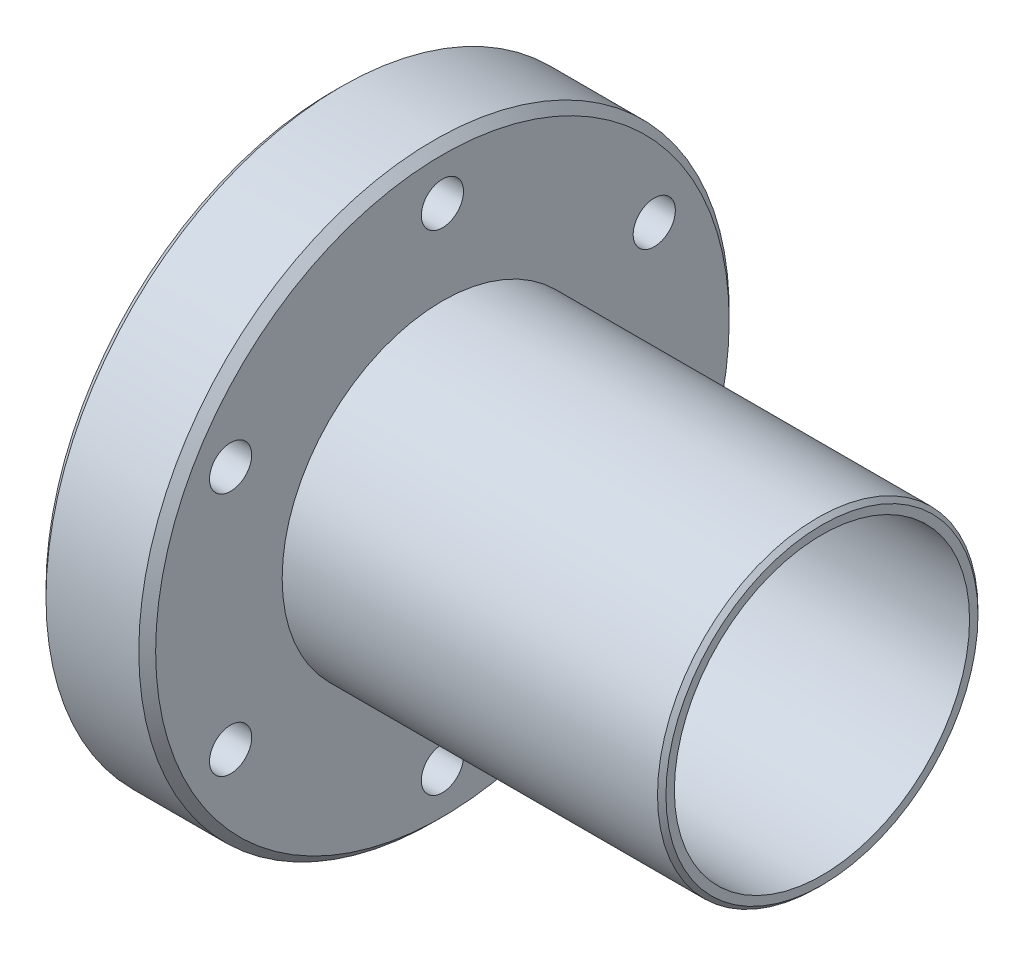
ISO-10303-21;
HEADER;
FILE_DESCRIPTION(('STEP AP214'),'2;1');
FILE_NAME('part.step','',(''),(''),'','','');
FILE_SCHEMA(('AUTOMOTIVE_DESIGN { 1 0 10303 214 1 1 1 1 }'));
ENDSEC;
DATA;
#1=APPLICATION_CONTEXT('core data for automotive mechanical design processes');
#2=APPLICATION_PROTOCOL_DEFINITION('international standard','automotive_design',2000,#1);
#3=PRODUCT_CONTEXT('',#1,'mechanical');
#4=PRODUCT('Part','Part','',(#3));
#5=PRODUCT_RELATED_PRODUCT_CATEGORY('part','',(#4));
#6=PRODUCT_DEFINITION_FORMATION('','',#4);
#7=PRODUCT_DEFINITION_CONTEXT('part definition',#1,'design');
#8=PRODUCT_DEFINITION('design','',#6,#7);
#9=PRODUCT_DEFINITION_SHAPE('','',#8);
#10=(LENGTH_UNIT() NAMED_UNIT(*) SI_UNIT(.MILLI.,.METRE.));
#11=(NAMED_UNIT(*) PLANE_ANGLE_UNIT() SI_UNIT($,.RADIAN.));
#12=(NAMED_UNIT(*) SI_UNIT($,.STERADIAN.) SOLID_ANGLE_UNIT());
#13=UNCERTAINTY_MEASURE_WITH_UNIT(LENGTH_MEASURE(1.E-05),#10,'distance_accuracy_value','');
#14=(GEOMETRIC_REPRESENTATION_CONTEXT(3) GLOBAL_UNCERTAINTY_ASSIGNED_CONTEXT((#13)) GLOBAL_UNIT_ASSIGNED_CONTEXT((#10,
#11,#12)) REPRESENTATION_CONTEXT('',''));
#15=CARTESIAN_POINT('',(0.,0.,0.));
#16=DIRECTION('',(0.,0.,1.));
#17=DIRECTION('',(1.,0.,0.));
#18=AXIS2_PLACEMENT_3D('',#15,#16,#17);
#19=CARTESIAN_POINT('',(0.,0.,0.));
#20=DIRECTION('',(-1.,0.,0.));
#21=DIRECTION('',(0.,0.,1.));
#22=AXIS2_PLACEMENT_3D('',#19,#20,#21);
#23=CYLINDRICAL_SURFACE('',#22,17.5);
#24=CARTESIAN_POINT('',(58.,0.,0.));
#25=DIRECTION('',(-1.,0.,0.));
#26=DIRECTION('',(0.,0.,1.));
#27=AXIS2_PLACEMENT_3D('',#24,#25,#26);
#28=CIRCLE('',#27,17.5);
#29=CARTESIAN_POINT('',(58.,0.,17.5));
#30=VERTEX_POINT('',#29);
#31=EDGE_CURVE('E119',#30,#30,#28,.T.);
#32=ORIENTED_EDGE('',*,*,#31,.F.);
#33=EDGE_LOOP('',(#32));
#34=FACE_BOUND('',#33,.T.);
#35=CARTESIAN_POINT('',(0.,0.,0.));
#36=DIRECTION('',(-1.,0.,0.));
#37=DIRECTION('',(0.,0.,1.));
#38=AXIS2_PLACEMENT_3D('',#35,#36,#37);
#39=CIRCLE('',#38,17.5);
#40=CARTESIAN_POINT('',(0.,0.,17.5));
#41=VERTEX_POINT('',#40);
#42=EDGE_CURVE('E88',#41,#41,#39,.T.);
#43=ORIENTED_EDGE('',*,*,#42,.T.);
#44=EDGE_LOOP('',(#43));
#45=FACE_BOUND('',#44,.T.);
#46=ADVANCED_FACE('F55',(#34,#45),#23,.F.);
#47=CARTESIAN_POINT('',(0.,17.5,0.));
#48=DIRECTION('',(1.,0.,0.));
#49=DIRECTION('',(0.,0.,-1.));
#50=AXIS2_PLACEMENT_3D('',#47,#48,#49);
#51=PLANE('',#50);
#52=CARTESIAN_POINT('',(0.,0.,0.));
#53=DIRECTION('',(1.,0.,0.));
#54=DIRECTION('',(0.,0.,-1.));
#55=AXIS2_PLACEMENT_3D('',#52,#53,#54);
#56=CIRCLE('',#55,34.);
#57=CARTESIAN_POINT('',(0.,0.,-34.));
#58=VERTEX_POINT('',#57);
#59=EDGE_CURVE('E84',#58,#58,#56,.F.);
#60=ORIENTED_EDGE('',*,*,#59,.T.);
#61=EDGE_LOOP('',(#60));
#62=FACE_BOUND('',#61,.T.);
#63=CARTESIAN_POINT('',(0.,14.5000000000003,-25.1147367097486));
#64=DIRECTION('',(-1.,0.,0.));
#65=DIRECTION('',(0.,0.,1.));
#66=AXIS2_PLACEMENT_3D('',#63,#64,#65);
#67=CIRCLE('',#66,2.49999999999999);
#68=CARTESIAN_POINT('',(0.,14.5000000000003,-22.6147367097486));
#69=VERTEX_POINT('',#68);
#70=EDGE_CURVE('E94',#69,#69,#67,.T.);
#71=ORIENTED_EDGE('',*,*,#70,.F.);
#72=EDGE_LOOP('',(#71));
#73=FACE_BOUND('',#72,.T.);
#74=CARTESIAN_POINT('',(0.,-14.4999999999998,-25.1147367097489));
#75=DIRECTION('',(-1.,0.,0.));
#76=DIRECTION('',(0.,0.,1.));
#77=AXIS2_PLACEMENT_3D('',#74,#75,#76);
#78=CIRCLE('',#77,2.49999999999999);
#79=CARTESIAN_POINT('',(0.,-14.4999999999998,-22.6147367097489));
#80=VERTEX_POINT('',#79);
#81=EDGE_CURVE('E93',#80,#80,#78,.T.);
#82=ORIENTED_EDGE('',*,*,#81,.F.);
#83=EDGE_LOOP('',(#82));
#84=FACE_BOUND('',#83,.T.);
#85=CARTESIAN_POINT('',(0.,-29.,0.));
#86=DIRECTION('',(-1.,0.,0.));
#87=DIRECTION('',(0.,0.,1.));
#88=AXIS2_PLACEMENT_3D('',#85,#86,#87);
#89=CIRCLE('',#88,2.49999999999999);
#90=CARTESIAN_POINT('',(0.,-29.,2.49999999999999));
#91=VERTEX_POINT('',#90);
#92=EDGE_CURVE('E99',#91,#91,#89,.T.);
#93=ORIENTED_EDGE('',*,*,#92,.F.);
#94=EDGE_LOOP('',(#93));
#95=FACE_BOUND('',#94,.T.);
#96=CARTESIAN_POINT('',(0.,-14.5000000000001,25.1147367097487));
#97=DIRECTION('',(-1.,0.,0.));
#98=DIRECTION('',(0.,0.,1.));
#99=AXIS2_PLACEMENT_3D('',#96,#97,#98);
#100=CIRCLE('',#99,2.49999999999999);
#101=CARTESIAN_POINT('',(0.,-14.5000000000001,27.6147367097486));
#102=VERTEX_POINT('',#101);
#103=EDGE_CURVE('E104',#102,#102,#100,.T.);
#104=ORIENTED_EDGE('',*,*,#103,.F.);
#105=EDGE_LOOP('',(#104));
#106=FACE_BOUND('',#105,.T.);
#107=CARTESIAN_POINT('',(0.,14.4999999999999,25.1147367097488));
#108=DIRECTION('',(-1.,0.,0.));
#109=DIRECTION('',(0.,0.,1.));
#110=AXIS2_PLACEMENT_3D('',#107,#108,#109);
#111=CIRCLE('',#110,2.49999999999999);
#112=CARTESIAN_POINT('',(0.,14.4999999999999,27.6147367097487));
#113=VERTEX_POINT('',#112);
#114=EDGE_CURVE('E109',#113,#113,#111,.T.);
#115=ORIENTED_EDGE('',*,*,#114,.F.);
#116=EDGE_LOOP('',(#115));
#117=FACE_BOUND('',#116,.T.);
#118=CARTESIAN_POINT('',(0.,29.,0.));
#119=DIRECTION('',(-1.,0.,0.));
#120=DIRECTION('',(0.,0.,1.));
#121=AXIS2_PLACEMENT_3D('',#118,#119,#120);
#122=CIRCLE('',#121,2.49999999999998);
#123=CARTESIAN_POINT('',(0.,29.,2.49999999999998));
#124=VERTEX_POINT('',#123);
#125=EDGE_CURVE('E114',#124,#124,#122,.T.);
#126=ORIENTED_EDGE('',*,*,#125,.F.);
#127=EDGE_LOOP('',(#126));
#128=FACE_BOUND('',#127,.T.);
#129=ORIENTED_EDGE('',*,*,#42,.F.);
#130=EDGE_LOOP('',(#129));
#131=FACE_BOUND('',#130,.T.);
#132=ADVANCED_FACE('F152',(#62,#73,#84,#95,#106,#117,#128,#131),#51,.F.);
#133=CARTESIAN_POINT('',(0.,0.,0.));
#134=DIRECTION('',(-1.,0.,0.));
#135=DIRECTION('',(0.,0.,1.));
#136=AXIS2_PLACEMENT_3D('',#133,#134,#135);
#137=CYLINDRICAL_SURFACE('',#136,35.);
#138=CARTESIAN_POINT('',(12.,0.,0.));
#139=DIRECTION('',(-1.,0.,0.));
#140=DIRECTION('',(0.,0.,1.));
#141=AXIS2_PLACEMENT_3D('',#138,#139,#140);
#142=CIRCLE('',#141,35.);
#143=CARTESIAN_POINT('',(12.,0.,35.));
#144=VERTEX_POINT('',#143);
#145=EDGE_CURVE('E74',#144,#144,#142,.T.);
#146=ORIENTED_EDGE('',*,*,#145,.T.);
#147=EDGE_LOOP('',(#146));
#148=FACE_BOUND('',#147,.T.);
#149=CARTESIAN_POINT('',(1.00000000000003,0.,0.));
#150=DIRECTION('',(1.,0.,0.));
#151=DIRECTION('',(0.,0.,-1.));
#152=AXIS2_PLACEMENT_3D('',#149,#150,#151);
#153=CIRCLE('',#152,35.);
#154=CARTESIAN_POINT('',(1.00000000000003,0.,-35.));
#155=VERTEX_POINT('',#154);
#156=EDGE_CURVE('E80',#155,#155,#153,.T.);
#157=ORIENTED_EDGE('',*,*,#156,.T.);
#158=EDGE_LOOP('',(#157));
#159=FACE_BOUND('',#158,.T.);
#160=ADVANCED_FACE('F155',(#148,#159),#137,.T.);
#161=CARTESIAN_POINT('',(13.,35.,0.));
#162=DIRECTION('',(-1.,0.,0.));
#163=DIRECTION('',(0.,0.,1.));
#164=AXIS2_PLACEMENT_3D('',#161,#162,#163);
#165=PLANE('',#164);
#166=CARTESIAN_POINT('',(13.,0.,0.));
#167=DIRECTION('',(-1.,0.,0.));
#168=DIRECTION('',(0.,0.,1.));
#169=AXIS2_PLACEMENT_3D('',#166,#167,#168);
#170=CIRCLE('',#169,34.);
#171=CARTESIAN_POINT('',(13.,0.,34.));
#172=VERTEX_POINT('',#171);
#173=EDGE_CURVE('E69',#172,#172,#170,.F.);
#174=ORIENTED_EDGE('',*,*,#173,.T.);
#175=EDGE_LOOP('',(#174));
#176=FACE_BOUND('',#175,.T.);
#177=CARTESIAN_POINT('',(13.,14.5000000000003,-25.1147367097486));
#178=DIRECTION('',(-1.,0.,0.));
#179=DIRECTION('',(0.,0.,1.));
#180=AXIS2_PLACEMENT_3D('',#177,#178,#179);
#181=CIRCLE('',#180,2.49999999999999);
#182=CARTESIAN_POINT('',(13.,14.5000000000003,-22.6147367097486));
#183=VERTEX_POINT('',#182);
#184=EDGE_CURVE('E89',#183,#183,#181,.T.);
#185=ORIENTED_EDGE('',*,*,#184,.T.);
#186=EDGE_LOOP('',(#185));
#187=FACE_BOUND('',#186,.T.);
#188=CARTESIAN_POINT('',(13.,-14.4999999999998,-25.1147367097489));
#189=DIRECTION('',(-1.,0.,0.));
#190=DIRECTION('',(0.,0.,1.));
#191=AXIS2_PLACEMENT_3D('',#188,#189,#190);
#192=CIRCLE('',#191,2.49999999999999);
#193=CARTESIAN_POINT('',(13.,-14.4999999999998,-22.6147367097489));
#194=VERTEX_POINT('',#193);
#195=EDGE_CURVE('E95',#194,#194,#192,.T.);
#196=ORIENTED_EDGE('',*,*,#195,.T.);
#197=EDGE_LOOP('',(#196));
#198=FACE_BOUND('',#197,.T.);
#199=CARTESIAN_POINT('',(13.,-29.,0.));
#200=DIRECTION('',(-1.,0.,0.));
#201=DIRECTION('',(0.,0.,1.));
#202=AXIS2_PLACEMENT_3D('',#199,#200,#201);
#203=CIRCLE('',#202,2.49999999999999);
#204=CARTESIAN_POINT('',(13.,-29.,2.49999999999999));
#205=VERTEX_POINT('',#204);
#206=EDGE_CURVE('E100',#205,#205,#203,.T.);
#207=ORIENTED_EDGE('',*,*,#206,.T.);
#208=EDGE_LOOP('',(#207));
#209=FACE_BOUND('',#208,.T.);
#210=CARTESIAN_POINT('',(13.,-14.5000000000001,25.1147367097487));
#211=DIRECTION('',(-1.,0.,0.));
#212=DIRECTION('',(0.,0.,1.));
#213=AXIS2_PLACEMENT_3D('',#210,#211,#212);
#214=CIRCLE('',#213,2.49999999999999);
#215=CARTESIAN_POINT('',(13.,-14.5000000000001,27.6147367097486));
#216=VERTEX_POINT('',#215);
#217=EDGE_CURVE('E105',#216,#216,#214,.T.);
#218=ORIENTED_EDGE('',*,*,#217,.T.);
#219=EDGE_LOOP('',(#218));
#220=FACE_BOUND('',#219,.T.);
#221=CARTESIAN_POINT('',(13.,14.4999999999999,25.1147367097488));
#222=DIRECTION('',(-1.,0.,0.));
#223=DIRECTION('',(0.,0.,1.));
#224=AXIS2_PLACEMENT_3D('',#221,#222,#223);
#225=CIRCLE('',#224,2.49999999999999);
#226=CARTESIAN_POINT('',(13.,14.4999999999999,27.6147367097487));
#227=VERTEX_POINT('',#226);
#228=EDGE_CURVE('E110',#227,#227,#225,.T.);
#229=ORIENTED_EDGE('',*,*,#228,.T.);
#230=EDGE_LOOP('',(#229));
#231=FACE_BOUND('',#230,.T.);
#232=CARTESIAN_POINT('',(13.,29.,0.));
#233=DIRECTION('',(-1.,0.,0.));
#234=DIRECTION('',(0.,0.,1.));
#235=AXIS2_PLACEMENT_3D('',#232,#233,#234);
#236=CIRCLE('',#235,2.49999999999999);
#237=CARTESIAN_POINT('',(13.,29.,2.49999999999999));
#238=VERTEX_POINT('',#237);
#239=EDGE_CURVE('E115',#238,#238,#236,.T.);
#240=ORIENTED_EDGE('',*,*,#239,.T.);
#241=EDGE_LOOP('',(#240));
#242=FACE_BOUND('',#241,.T.);
#243=CARTESIAN_POINT('',(13.,0.,0.));
#244=DIRECTION('',(-1.,0.,0.));
#245=DIRECTION('',(0.,0.,1.));
#246=AXIS2_PLACEMENT_3D('',#243,#244,#245);
#247=CIRCLE('',#246,19.);
#248=CARTESIAN_POINT('',(13.,0.,19.));
#249=VERTEX_POINT('',#248);
#250=EDGE_CURVE('E123',#249,#249,#247,.T.);
#251=ORIENTED_EDGE('',*,*,#250,.T.);
#252=EDGE_LOOP('',(#251));
#253=FACE_BOUND('',#252,.T.);
#254=ADVANCED_FACE('F203',(#176,#187,#198,#209,#220,#231,#242,#253),#165,.F.);
#255=CARTESIAN_POINT('',(0.,0.,0.));
#256=DIRECTION('',(-1.,0.,0.));
#257=DIRECTION('',(0.,0.,1.));
#258=AXIS2_PLACEMENT_3D('',#255,#256,#257);
#259=CYLINDRICAL_SURFACE('',#258,19.);
#260=CARTESIAN_POINT('',(57.5,0.,0.));
#261=DIRECTION('',(-1.,0.,0.));
#262=DIRECTION('',(0.,0.,1.));
#263=AXIS2_PLACEMENT_3D('',#260,#261,#262);
#264=CIRCLE('',#263,19.);
#265=CARTESIAN_POINT('',(57.5,0.,19.));
#266=VERTEX_POINT('',#265);
#267=EDGE_CURVE('E64',#266,#266,#264,.T.);
#268=ORIENTED_EDGE('',*,*,#267,.T.);
#269=EDGE_LOOP('',(#268));
#270=FACE_BOUND('',#269,.T.);
#271=ORIENTED_EDGE('',*,*,#250,.F.);
#272=EDGE_LOOP('',(#271));
#273=FACE_BOUND('',#272,.T.);
#274=ADVANCED_FACE('F209',(#270,#273),#259,.T.);
#275=CARTESIAN_POINT('',(58.,19.,0.));
#276=DIRECTION('',(-1.,0.,0.));
#277=DIRECTION('',(0.,0.,1.));
#278=AXIS2_PLACEMENT_3D('',#275,#276,#277);
#279=PLANE('',#278);
#280=CARTESIAN_POINT('',(58.,0.,0.));
#281=DIRECTION('',(-1.,0.,0.));
#282=DIRECTION('',(0.,0.,1.));
#283=AXIS2_PLACEMENT_3D('',#280,#281,#282);
#284=CIRCLE('',#283,18.5);
#285=CARTESIAN_POINT('',(58.,0.,18.5));
#286=VERTEX_POINT('',#285);
#287=EDGE_CURVE('E10',#286,#286,#284,.F.);
#288=ORIENTED_EDGE('',*,*,#287,.T.);
#289=EDGE_LOOP('',(#288));
#290=FACE_BOUND('',#289,.T.);
#291=ORIENTED_EDGE('',*,*,#31,.T.);
#292=EDGE_LOOP('',(#291));
#293=FACE_BOUND('',#292,.T.);
#294=ADVANCED_FACE('F214',(#290,#293),#279,.F.);
#295=CARTESIAN_POINT('',(0.,29.,0.));
#296=DIRECTION('',(-1.,0.,0.));
#297=DIRECTION('',(0.,0.,1.));
#298=AXIS2_PLACEMENT_3D('',#295,#296,#297);
#299=CYLINDRICAL_SURFACE('',#298,2.49999999999999);
#300=ORIENTED_EDGE('',*,*,#125,.T.);
#301=EDGE_LOOP('',(#300));
#302=FACE_BOUND('',#301,.T.);
#303=ORIENTED_EDGE('',*,*,#239,.F.);
#304=EDGE_LOOP('',(#303));
#305=FACE_BOUND('',#304,.T.);
#306=ADVANCED_FACE('F217',(#302,#305),#299,.F.);
#307=CARTESIAN_POINT('',(0.,14.4999999999999,25.1147367097488));
#308=DIRECTION('',(-1.,0.,0.));
#309=DIRECTION('',(0.,0.,1.));
#310=AXIS2_PLACEMENT_3D('',#307,#308,#309);
#311=CYLINDRICAL_SURFACE('',#310,2.49999999999999);
#312=ORIENTED_EDGE('',*,*,#114,.T.);
#313=EDGE_LOOP('',(#312));
#314=FACE_BOUND('',#313,.T.);
#315=ORIENTED_EDGE('',*,*,#228,.F.);
#316=EDGE_LOOP('',(#315));
#317=FACE_BOUND('',#316,.T.);
#318=ADVANCED_FACE('F220',(#314,#317),#311,.F.);
#319=CARTESIAN_POINT('',(0.,-14.5000000000001,25.1147367097487));
#320=DIRECTION('',(-1.,0.,0.));
#321=DIRECTION('',(0.,0.,1.));
#322=AXIS2_PLACEMENT_3D('',#319,#320,#321);
#323=CYLINDRICAL_SURFACE('',#322,2.49999999999999);
#324=ORIENTED_EDGE('',*,*,#103,.T.);
#325=EDGE_LOOP('',(#324));
#326=FACE_BOUND('',#325,.T.);
#327=ORIENTED_EDGE('',*,*,#217,.F.);
#328=EDGE_LOOP('',(#327));
#329=FACE_BOUND('',#328,.T.);
#330=ADVANCED_FACE('F224',(#326,#329),#323,.F.);
#331=CARTESIAN_POINT('',(0.,-29.,0.));
#332=DIRECTION('',(-1.,0.,0.));
#333=DIRECTION('',(0.,0.,1.));
#334=AXIS2_PLACEMENT_3D('',#331,#332,#333);
#335=CYLINDRICAL_SURFACE('',#334,2.49999999999999);
#336=ORIENTED_EDGE('',*,*,#92,.T.);
#337=EDGE_LOOP('',(#336));
#338=FACE_BOUND('',#337,.T.);
#339=ORIENTED_EDGE('',*,*,#206,.F.);
#340=EDGE_LOOP('',(#339));
#341=FACE_BOUND('',#340,.T.);
#342=ADVANCED_FACE('F228',(#338,#341),#335,.F.);
#343=CARTESIAN_POINT('',(0.,-14.4999999999998,-25.1147367097489));
#344=DIRECTION('',(-1.,0.,0.));
#345=DIRECTION('',(0.,0.,1.));
#346=AXIS2_PLACEMENT_3D('',#343,#344,#345);
#347=CYLINDRICAL_SURFACE('',#346,2.49999999999999);
#348=ORIENTED_EDGE('',*,*,#81,.T.);
#349=EDGE_LOOP('',(#348));
#350=FACE_BOUND('',#349,.T.);
#351=ORIENTED_EDGE('',*,*,#195,.F.);
#352=EDGE_LOOP('',(#351));
#353=FACE_BOUND('',#352,.T.);
#354=ADVANCED_FACE('F232',(#350,#353),#347,.F.);
#355=CARTESIAN_POINT('',(0.,14.5000000000003,-25.1147367097486));
#356=DIRECTION('',(-1.,0.,0.));
#357=DIRECTION('',(0.,0.,1.));
#358=AXIS2_PLACEMENT_3D('',#355,#356,#357);
#359=CYLINDRICAL_SURFACE('',#358,2.49999999999999);
#360=ORIENTED_EDGE('',*,*,#70,.T.);
#361=EDGE_LOOP('',(#360));
#362=FACE_BOUND('',#361,.T.);
#363=ORIENTED_EDGE('',*,*,#184,.F.);
#364=EDGE_LOOP('',(#363));
#365=FACE_BOUND('',#364,.T.);
#366=ADVANCED_FACE('F149',(#362,#365),#359,.F.);
#367=CARTESIAN_POINT('',(0.,0.,0.));
#368=DIRECTION('',(1.,0.,0.));
#369=DIRECTION('',(0.,0.,-1.));
#370=AXIS2_PLACEMENT_3D('',#367,#368,#369);
#371=CONICAL_SURFACE('',#370,34.,0.785398163397448);
#372=ORIENTED_EDGE('',*,*,#156,.F.);
#373=EDGE_LOOP('',(#372));
#374=FACE_BOUND('',#373,.T.);
#375=ORIENTED_EDGE('',*,*,#59,.F.);
#376=EDGE_LOOP('',(#375));
#377=FACE_BOUND('',#376,.T.);
#378=ADVANCED_FACE('F180',(#374,#377),#371,.T.);
#379=CARTESIAN_POINT('',(12.,0.,0.));
#380=DIRECTION('',(-1.,0.,0.));
#381=DIRECTION('',(0.,0.,1.));
#382=AXIS2_PLACEMENT_3D('',#379,#380,#381);
#383=CONICAL_SURFACE('',#382,35.,0.785398163397452);
#384=ORIENTED_EDGE('',*,*,#173,.F.);
#385=EDGE_LOOP('',(#384));
#386=FACE_BOUND('',#385,.T.);
#387=ORIENTED_EDGE('',*,*,#145,.F.);
#388=EDGE_LOOP('',(#387));
#389=FACE_BOUND('',#388,.T.);
#390=ADVANCED_FACE('F185',(#386,#389),#383,.T.);
#391=CARTESIAN_POINT('',(57.5,0.,0.));
#392=DIRECTION('',(-1.,0.,0.));
#393=DIRECTION('',(0.,0.,1.));
#394=AXIS2_PLACEMENT_3D('',#391,#392,#393);
#395=CONICAL_SURFACE('',#394,19.,0.785398163397466);
#396=ORIENTED_EDGE('',*,*,#287,.F.);
#397=EDGE_LOOP('',(#396));
#398=FACE_BOUND('',#397,.T.);
#399=ORIENTED_EDGE('',*,*,#267,.F.);
#400=EDGE_LOOP('',(#399));
#401=FACE_BOUND('',#400,.T.);
#402=ADVANCED_FACE('F58',(#398,#401),#395,.T.);
#403=CLOSED_SHELL('',(#46,#132,#160,#254,#274,#294,#306,#318,#330,#342,#354,#366,#378,#390,#402));
#404=MANIFOLD_SOLID_BREP('B2',#403);
#405=ADVANCED_BREP_SHAPE_REPRESENTATION('',(#18,#404),#14);
#406=SHAPE_DEFINITION_REPRESENTATION(#9,#405);
ENDSEC;
END-ISO-10303-21;
